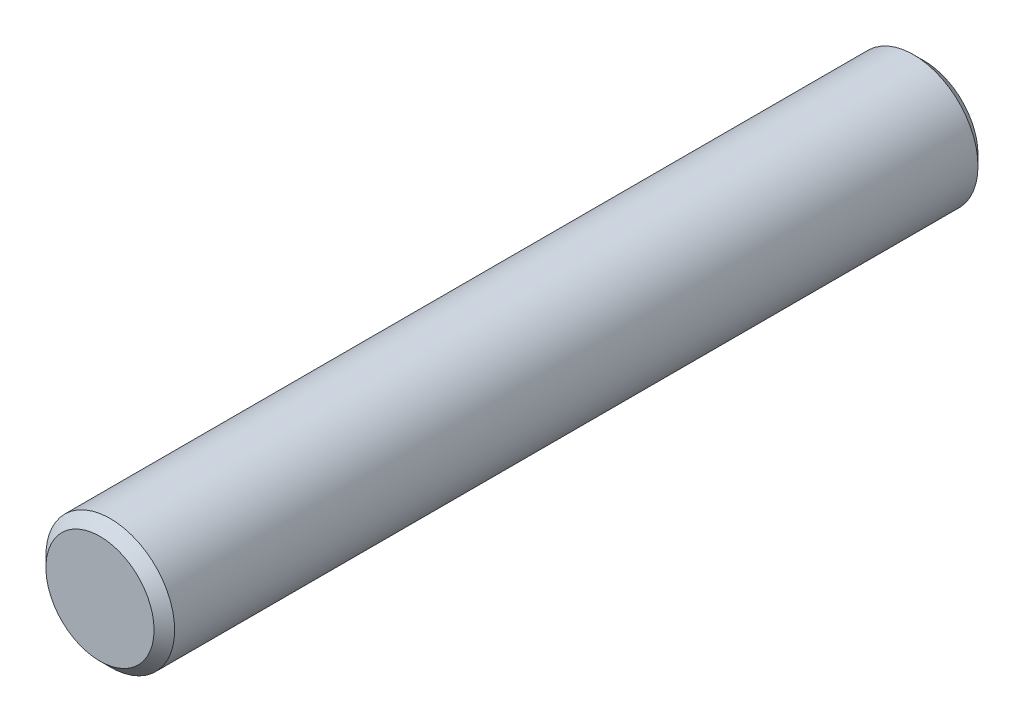
ISO-10303-21;
HEADER;
FILE_DESCRIPTION(('STEP AP214'),'2;1');
FILE_NAME('part.step','',(''),(''),'','','');
FILE_SCHEMA(('AUTOMOTIVE_DESIGN { 1 0 10303 214 1 1 1 1 }'));
ENDSEC;
DATA;
#1=APPLICATION_CONTEXT('core data for automotive mechanical design processes');
#2=APPLICATION_PROTOCOL_DEFINITION('international standard','automotive_design',2000,#1);
#3=PRODUCT_CONTEXT('',#1,'mechanical');
#4=PRODUCT('Part','Part','',(#3));
#5=PRODUCT_RELATED_PRODUCT_CATEGORY('part','',(#4));
#6=PRODUCT_DEFINITION_FORMATION('','',#4);
#7=PRODUCT_DEFINITION_CONTEXT('part definition',#1,'design');
#8=PRODUCT_DEFINITION('design','',#6,#7);
#9=PRODUCT_DEFINITION_SHAPE('','',#8);
#10=(LENGTH_UNIT() NAMED_UNIT(*) SI_UNIT(.MILLI.,.METRE.));
#11=(NAMED_UNIT(*) PLANE_ANGLE_UNIT() SI_UNIT($,.RADIAN.));
#12=(NAMED_UNIT(*) SI_UNIT($,.STERADIAN.) SOLID_ANGLE_UNIT());
#13=UNCERTAINTY_MEASURE_WITH_UNIT(LENGTH_MEASURE(1.E-05),#10,'distance_accuracy_value','');
#14=(GEOMETRIC_REPRESENTATION_CONTEXT(3) GLOBAL_UNCERTAINTY_ASSIGNED_CONTEXT((#13)) GLOBAL_UNIT_ASSIGNED_CONTEXT((#10,
#11,#12)) REPRESENTATION_CONTEXT('',''));
#15=CARTESIAN_POINT('',(0.,0.,0.));
#16=DIRECTION('',(0.,0.,1.));
#17=DIRECTION('',(1.,0.,0.));
#18=AXIS2_PLACEMENT_3D('',#15,#16,#17);
#19=CARTESIAN_POINT('',(0.,0.,81.28));
#20=DIRECTION('',(0.,0.,-1.));
#21=DIRECTION('',(-1.,0.,0.));
#22=AXIS2_PLACEMENT_3D('',#19,#20,#21);
#23=CYLINDRICAL_SURFACE('',#22,6.35);
#24=CARTESIAN_POINT('',(0.,0.,1.016));
#25=DIRECTION('',(0.,0.,1.));
#26=DIRECTION('',(1.,0.,0.));
#27=AXIS2_PLACEMENT_3D('',#24,#25,#26);
#28=CIRCLE('',#27,6.35);
#29=CARTESIAN_POINT('',(6.35,0.,1.016));
#30=VERTEX_POINT('',#29);
#31=EDGE_CURVE('E43',#30,#30,#28,.T.);
#32=ORIENTED_EDGE('',*,*,#31,.T.);
#33=EDGE_LOOP('',(#32));
#34=FACE_BOUND('',#33,.T.);
#35=CARTESIAN_POINT('',(0.,0.,80.264));
#36=DIRECTION('',(0.,0.,1.));
#37=DIRECTION('',(1.,0.,0.));
#38=AXIS2_PLACEMENT_3D('',#35,#36,#37);
#39=CIRCLE('',#38,6.35);
#40=CARTESIAN_POINT('',(6.35,0.,80.264));
#41=VERTEX_POINT('',#40);
#42=EDGE_CURVE('E47',#41,#41,#39,.F.);
#43=ORIENTED_EDGE('',*,*,#42,.T.);
#44=EDGE_LOOP('',(#43));
#45=FACE_BOUND('',#44,.T.);
#46=ADVANCED_FACE('F32',(#34,#45),#23,.T.);
#47=CARTESIAN_POINT('',(0.,0.,81.28));
#48=DIRECTION('',(0.,0.,1.));
#49=DIRECTION('',(1.,0.,0.));
#50=AXIS2_PLACEMENT_3D('',#47,#48,#49);
#51=PLANE('',#50);
#52=CARTESIAN_POINT('',(0.,0.,81.28));
#53=DIRECTION('',(0.,0.,1.));
#54=DIRECTION('',(1.,0.,0.));
#55=AXIS2_PLACEMENT_3D('',#52,#53,#54);
#56=CIRCLE('',#55,5.33399999999999);
#57=CARTESIAN_POINT('',(5.33399999999999,0.,81.28));
#58=VERTEX_POINT('',#57);
#59=EDGE_CURVE('E10',#58,#58,#56,.T.);
#60=ORIENTED_EDGE('',*,*,#59,.T.);
#61=EDGE_LOOP('',(#60));
#62=FACE_BOUND('',#61,.T.);
#63=ADVANCED_FACE('F63',(#62),#51,.T.);
#64=CARTESIAN_POINT('',(0.,0.,0.));
#65=DIRECTION('',(0.,0.,1.));
#66=DIRECTION('',(1.,0.,0.));
#67=AXIS2_PLACEMENT_3D('',#64,#65,#66);
#68=PLANE('',#67);
#69=CARTESIAN_POINT('',(0.,0.,0.));
#70=DIRECTION('',(0.,0.,1.));
#71=DIRECTION('',(1.,0.,0.));
#72=AXIS2_PLACEMENT_3D('',#69,#70,#71);
#73=CIRCLE('',#72,5.33399999999999);
#74=CARTESIAN_POINT('',(5.33399999999999,0.,0.));
#75=VERTEX_POINT('',#74);
#76=EDGE_CURVE('E39',#75,#75,#73,.F.);
#77=ORIENTED_EDGE('',*,*,#76,.T.);
#78=EDGE_LOOP('',(#77));
#79=FACE_BOUND('',#78,.T.);
#80=ADVANCED_FACE('F60',(#79),#68,.F.);
#81=CARTESIAN_POINT('',(0.,0.,1.016));
#82=DIRECTION('',(0.,0.,1.));
#83=DIRECTION('',(1.,0.,0.));
#84=AXIS2_PLACEMENT_3D('',#81,#82,#83);
#85=CONICAL_SURFACE('',#84,6.35,0.78539816339745);
#86=ORIENTED_EDGE('',*,*,#76,.F.);
#87=EDGE_LOOP('',(#86));
#88=FACE_BOUND('',#87,.T.);
#89=ORIENTED_EDGE('',*,*,#31,.F.);
#90=EDGE_LOOP('',(#89));
#91=FACE_BOUND('',#90,.T.);
#92=ADVANCED_FACE('F56',(#88,#91),#85,.T.);
#93=CARTESIAN_POINT('',(0.,0.,81.28));
#94=DIRECTION('',(0.,0.,-1.));
#95=DIRECTION('',(-1.,0.,0.));
#96=AXIS2_PLACEMENT_3D('',#93,#94,#95);
#97=CONICAL_SURFACE('',#96,5.33399999999999,0.785398163397444);
#98=ORIENTED_EDGE('',*,*,#42,.F.);
#99=EDGE_LOOP('',(#98));
#100=FACE_BOUND('',#99,.T.);
#101=ORIENTED_EDGE('',*,*,#59,.F.);
#102=EDGE_LOOP('',(#101));
#103=FACE_BOUND('',#102,.T.);
#104=ADVANCED_FACE('F34',(#100,#103),#97,.T.);
#105=CLOSED_SHELL('',(#46,#63,#80,#92,#104));
#106=MANIFOLD_SOLID_BREP('B2',#105);
#107=ADVANCED_BREP_SHAPE_REPRESENTATION('',(#18,#106),#14);
#108=SHAPE_DEFINITION_REPRESENTATION(#9,#107);
ENDSEC;
END-ISO-10303-21;
